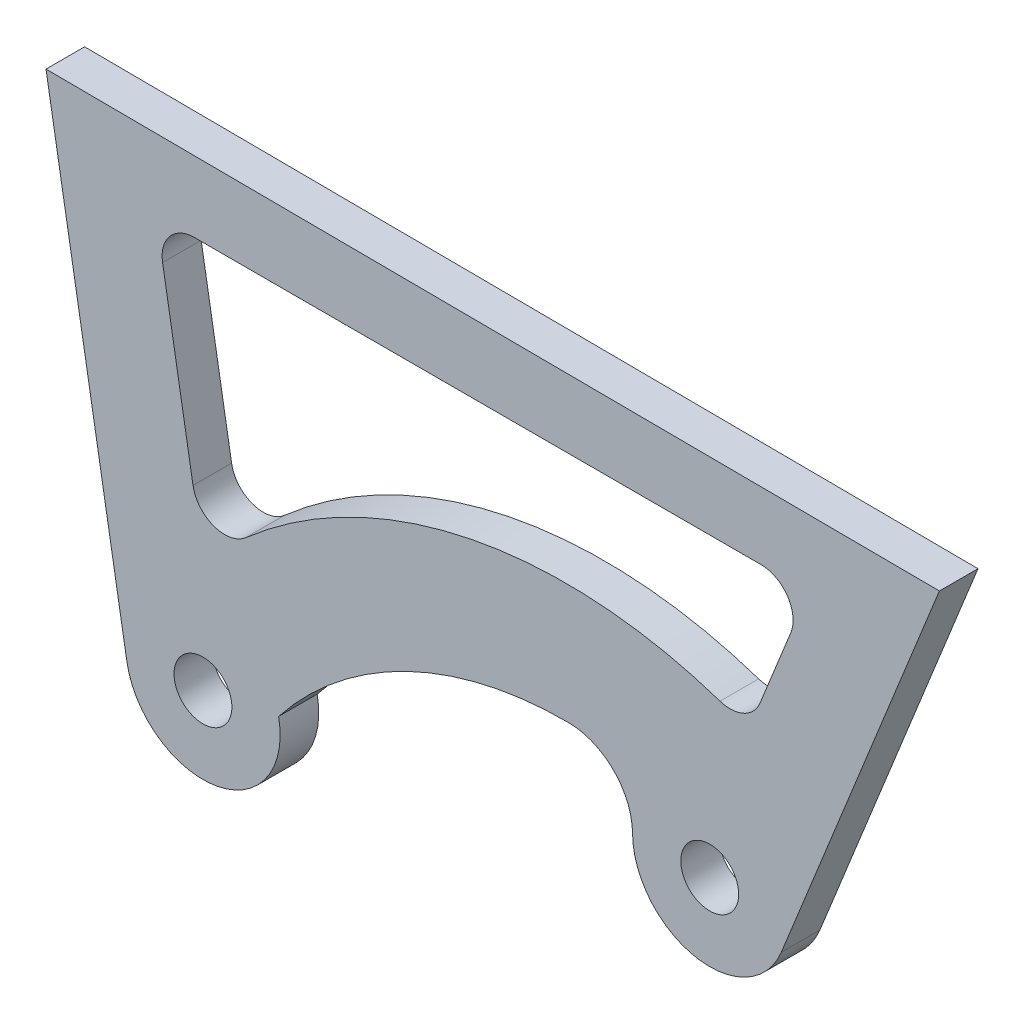
ISO-10303-21;
HEADER;
FILE_DESCRIPTION(('STEP AP214'),'2;1');
FILE_NAME('part.step','',(''),(''),'','','');
FILE_SCHEMA(('AUTOMOTIVE_DESIGN { 1 0 10303 214 1 1 1 1 }'));
ENDSEC;
DATA;
#1=APPLICATION_CONTEXT('core data for automotive mechanical design processes');
#2=APPLICATION_PROTOCOL_DEFINITION('international standard','automotive_design',2000,#1);
#3=PRODUCT_CONTEXT('',#1,'mechanical');
#4=PRODUCT('Part','Part','',(#3));
#5=PRODUCT_RELATED_PRODUCT_CATEGORY('part','',(#4));
#6=PRODUCT_DEFINITION_FORMATION('','',#4);
#7=PRODUCT_DEFINITION_CONTEXT('part definition',#1,'design');
#8=PRODUCT_DEFINITION('design','',#6,#7);
#9=PRODUCT_DEFINITION_SHAPE('','',#8);
#10=(LENGTH_UNIT() NAMED_UNIT(*) SI_UNIT(.MILLI.,.METRE.));
#11=(NAMED_UNIT(*) PLANE_ANGLE_UNIT() SI_UNIT($,.RADIAN.));
#12=(NAMED_UNIT(*) SI_UNIT($,.STERADIAN.) SOLID_ANGLE_UNIT());
#13=UNCERTAINTY_MEASURE_WITH_UNIT(LENGTH_MEASURE(1.E-05),#10,'distance_accuracy_value','');
#14=(GEOMETRIC_REPRESENTATION_CONTEXT(3) GLOBAL_UNCERTAINTY_ASSIGNED_CONTEXT((#13)) GLOBAL_UNIT_ASSIGNED_CONTEXT((#10,
#11,#12)) REPRESENTATION_CONTEXT('',''));
#15=CARTESIAN_POINT('',(0.,0.,0.));
#16=DIRECTION('',(0.,0.,1.));
#17=DIRECTION('',(1.,0.,0.));
#18=AXIS2_PLACEMENT_3D('',#15,#16,#17);
#19=CARTESIAN_POINT('',(4.70013636969245E-13,-372.949836208111,-6.));
#20=DIRECTION('',(0.,1.,0.));
#21=DIRECTION('',(-1.,0.,0.));
#22=AXIS2_PLACEMENT_3D('',#19,#20,#21);
#23=PLANE('',#22);
#24=DIRECTION('',(-1.,0.,0.));
#25=VECTOR('',#24,1.);
#26=CARTESIAN_POINT('',(4.70013636969245E-13,-372.949836208111,0.));
#27=LINE('',#26,#25);
#28=CARTESIAN_POINT('',(510.342575031471,-372.94983620811,0.));
#29=VERTEX_POINT('',#28);
#30=CARTESIAN_POINT('',(422.247791684681,-372.94983620811,0.));
#31=VERTEX_POINT('',#30);
#32=EDGE_CURVE('E207',#29,#31,#27,.T.);
#33=ORIENTED_EDGE('',*,*,#32,.T.);
#34=DIRECTION('',(0.,0.,1.));
#35=VECTOR('',#34,1.);
#36=CARTESIAN_POINT('',(422.247791684681,-372.94983620811,-6.));
#37=LINE('',#36,#35);
#38=CARTESIAN_POINT('',(422.247791684681,-372.94983620811,-6.));
#39=VERTEX_POINT('',#38);
#40=EDGE_CURVE('E11',#39,#31,#37,.T.);
#41=ORIENTED_EDGE('',*,*,#40,.F.);
#42=DIRECTION('',(-1.,0.,0.));
#43=VECTOR('',#42,1.);
#44=CARTESIAN_POINT('',(4.70013636969245E-13,-372.949836208111,-6.));
#45=LINE('',#44,#43);
#46=CARTESIAN_POINT('',(510.342575031471,-372.94983620811,-6.));
#47=VERTEX_POINT('',#46);
#48=EDGE_CURVE('E324',#47,#39,#45,.T.);
#49=ORIENTED_EDGE('',*,*,#48,.F.);
#50=DIRECTION('',(0.,0.,1.));
#51=VECTOR('',#50,1.);
#52=CARTESIAN_POINT('',(510.342575031471,-372.94983620811,-6.));
#53=LINE('',#52,#51);
#54=EDGE_CURVE('E235',#47,#29,#53,.T.);
#55=ORIENTED_EDGE('',*,*,#54,.T.);
#56=EDGE_LOOP('',(#33,#41,#49,#55));
#57=FACE_BOUND('',#56,.T.);
#58=ADVANCED_FACE('F41',(#57),#23,.F.);
#59=CARTESIAN_POINT('',(422.247791684681,-377.94983620811,-6.));
#60=DIRECTION('',(0.,0.,1.));
#61=DIRECTION('',(1.,0.,0.));
#62=AXIS2_PLACEMENT_3D('',#59,#60,#61);
#63=CYLINDRICAL_SURFACE('',#62,5.00000000000012);
#64=CARTESIAN_POINT('',(422.247791684681,-377.94983620811,0.));
#65=DIRECTION('',(0.,0.,1.));
#66=DIRECTION('',(1.,0.,0.));
#67=AXIS2_PLACEMENT_3D('',#64,#65,#66);
#68=CIRCLE('',#67,5.00000000000012);
#69=CARTESIAN_POINT('',(417.319428606997,-378.793185112492,0.));
#70=VERTEX_POINT('',#69);
#71=EDGE_CURVE('E106',#31,#70,#68,.T.);
#72=ORIENTED_EDGE('',*,*,#71,.T.);
#73=DIRECTION('',(0.,0.,1.));
#74=VECTOR('',#73,1.);
#75=CARTESIAN_POINT('',(417.319428606997,-378.793185112492,-6.));
#76=LINE('',#75,#74);
#77=CARTESIAN_POINT('',(417.319428606997,-378.793185112492,-6.));
#78=VERTEX_POINT('',#77);
#79=EDGE_CURVE('E51',#78,#70,#76,.T.);
#80=ORIENTED_EDGE('',*,*,#79,.F.);
#81=CARTESIAN_POINT('',(422.247791684681,-377.94983620811,-6.));
#82=DIRECTION('',(0.,0.,1.));
#83=DIRECTION('',(1.,0.,0.));
#84=AXIS2_PLACEMENT_3D('',#81,#82,#83);
#85=CIRCLE('',#84,5.00000000000012);
#86=EDGE_CURVE('E59',#39,#78,#85,.T.);
#87=ORIENTED_EDGE('',*,*,#86,.F.);
#88=ORIENTED_EDGE('',*,*,#40,.T.);
#89=EDGE_LOOP('',(#72,#80,#87,#88));
#90=FACE_BOUND('',#89,.T.);
#91=ADVANCED_FACE('F273',(#90),#63,.F.);
#92=CARTESIAN_POINT('',(342.471328485273,58.6042089650436,-6.));
#93=DIRECTION('',(-0.985672615536786,-0.168669780876337,0.));
#94=DIRECTION('',(0.168669780876337,-0.985672615536786,0.));
#95=AXIS2_PLACEMENT_3D('',#92,#93,#94);
#96=PLANE('',#95);
#97=DIRECTION('',(0.168669780876337,-0.985672615536786,0.));
#98=VECTOR('',#97,1.);
#99=CARTESIAN_POINT('',(342.471328485273,58.6042089650436,0.));
#100=LINE('',#99,#98);
#101=CARTESIAN_POINT('',(422.050350523312,-406.43975081577,0.));
#102=VERTEX_POINT('',#101);
#103=EDGE_CURVE('E166',#70,#102,#100,.T.);
#104=ORIENTED_EDGE('',*,*,#103,.T.);
#105=DIRECTION('',(0.,0.,1.));
#106=VECTOR('',#105,1.);
#107=CARTESIAN_POINT('',(422.050350523312,-406.43975081577,-6.));
#108=LINE('',#107,#106);
#109=CARTESIAN_POINT('',(422.050350523312,-406.43975081577,-6.));
#110=VERTEX_POINT('',#109);
#111=EDGE_CURVE('E164',#110,#102,#108,.T.);
#112=ORIENTED_EDGE('',*,*,#111,.F.);
#113=DIRECTION('',(0.168669780876337,-0.985672615536786,0.));
#114=VECTOR('',#113,1.);
#115=CARTESIAN_POINT('',(342.471328485273,58.6042089650436,-6.));
#116=LINE('',#115,#114);
#117=EDGE_CURVE('E154',#78,#110,#116,.T.);
#118=ORIENTED_EDGE('',*,*,#117,.F.);
#119=ORIENTED_EDGE('',*,*,#79,.T.);
#120=EDGE_LOOP('',(#104,#112,#118,#119));
#121=FACE_BOUND('',#120,.T.);
#122=ADVANCED_FACE('F165',(#121),#96,.F.);
#123=CARTESIAN_POINT('',(426.978713600997,-405.596401911388,-6.));
#124=DIRECTION('',(0.,0.,1.));
#125=DIRECTION('',(1.,0.,0.));
#126=AXIS2_PLACEMENT_3D('',#123,#124,#125);
#127=CYLINDRICAL_SURFACE('',#126,5.00000000000004);
#128=CARTESIAN_POINT('',(426.978713600997,-405.596401911388,0.));
#129=DIRECTION('',(0.,0.,1.));
#130=DIRECTION('',(1.,0.,0.));
#131=AXIS2_PLACEMENT_3D('',#128,#129,#130);
#132=CIRCLE('',#131,5.00000000000004);
#133=CARTESIAN_POINT('',(430.277606865992,-409.353701902894,0.));
#134=VERTEX_POINT('',#133);
#135=EDGE_CURVE('E222',#102,#134,#132,.T.);
#136=ORIENTED_EDGE('',*,*,#135,.T.);
#137=DIRECTION('',(0.,0.,1.));
#138=VECTOR('',#137,1.);
#139=CARTESIAN_POINT('',(430.277606865992,-409.353701902894,-6.));
#140=LINE('',#139,#138);
#141=CARTESIAN_POINT('',(430.277606865992,-409.353701902894,-6.));
#142=VERTEX_POINT('',#141);
#143=EDGE_CURVE('E170',#142,#134,#140,.T.);
#144=ORIENTED_EDGE('',*,*,#143,.F.);
#145=CARTESIAN_POINT('',(426.978713600997,-405.596401911388,-6.));
#146=DIRECTION('',(0.,0.,1.));
#147=DIRECTION('',(1.,0.,0.));
#148=AXIS2_PLACEMENT_3D('',#145,#146,#147);
#149=CIRCLE('',#148,5.00000000000004);
#150=EDGE_CURVE('E159',#110,#142,#149,.T.);
#151=ORIENTED_EDGE('',*,*,#150,.F.);
#152=ORIENTED_EDGE('',*,*,#111,.T.);
#153=EDGE_LOOP('',(#136,#144,#151,#152));
#154=FACE_BOUND('',#153,.T.);
#155=ADVANCED_FACE('F172',(#154),#127,.F.);
#156=CARTESIAN_POINT('',(480.033722098236,-466.023814065418,-6.));
#157=DIRECTION('',(0.,0.,1.));
#158=DIRECTION('',(1.,0.,0.));
#159=AXIS2_PLACEMENT_3D('',#156,#157,#158);
#160=CYLINDRICAL_SURFACE('',#159,75.4133450757719);
#161=CARTESIAN_POINT('',(480.033722098236,-466.023814065418,0.));
#162=DIRECTION('',(0.,0.,1.));
#163=DIRECTION('',(1.,0.,0.));
#164=AXIS2_PLACEMENT_3D('',#161,#162,#163);
#165=CIRCLE('',#164,75.4133450757719);
#166=CARTESIAN_POINT('',(503.985021193238,-394.515018192608,0.));
#167=VERTEX_POINT('',#166);
#168=EDGE_CURVE('E219',#167,#134,#165,.T.);
#169=ORIENTED_EDGE('',*,*,#168,.F.);
#170=DIRECTION('',(0.,0.,1.));
#171=VECTOR('',#170,1.);
#172=CARTESIAN_POINT('',(503.985021193238,-394.515018192608,-6.));
#173=LINE('',#172,#171);
#174=CARTESIAN_POINT('',(503.985021193238,-394.515018192608,-6.));
#175=VERTEX_POINT('',#174);
#176=EDGE_CURVE('E229',#175,#167,#173,.T.);
#177=ORIENTED_EDGE('',*,*,#176,.F.);
#178=CARTESIAN_POINT('',(480.033722098236,-466.023814065418,-6.));
#179=DIRECTION('',(0.,0.,1.));
#180=DIRECTION('',(1.,0.,0.));
#181=AXIS2_PLACEMENT_3D('',#178,#179,#180);
#182=CIRCLE('',#181,75.4133450757719);
#183=EDGE_CURVE('E174',#175,#142,#182,.T.);
#184=ORIENTED_EDGE('',*,*,#183,.T.);
#185=ORIENTED_EDGE('',*,*,#143,.T.);
#186=EDGE_LOOP('',(#169,#177,#184,#185));
#187=FACE_BOUND('',#186,.T.);
#188=ADVANCED_FACE('F347',(#187),#160,.T.);
#189=CARTESIAN_POINT('',(505.573022565604,-389.773894734886,-6.));
#190=DIRECTION('',(0.,0.,1.));
#191=DIRECTION('',(1.,0.,0.));
#192=AXIS2_PLACEMENT_3D('',#189,#190,#191);
#193=CYLINDRICAL_SURFACE('',#192,4.99999999999996);
#194=CARTESIAN_POINT('',(505.573022565604,-389.773894734886,0.));
#195=DIRECTION('',(0.,0.,1.));
#196=DIRECTION('',(1.,0.,0.));
#197=AXIS2_PLACEMENT_3D('',#194,#195,#196);
#198=CIRCLE('',#197,4.99999999999996);
#199=CARTESIAN_POINT('',(510.209986836227,-391.644339161476,0.));
#200=VERTEX_POINT('',#199);
#201=EDGE_CURVE('E216',#200,#167,#198,.F.);
#202=ORIENTED_EDGE('',*,*,#201,.F.);
#203=DIRECTION('',(0.,0.,1.));
#204=VECTOR('',#203,1.);
#205=CARTESIAN_POINT('',(510.209986836227,-391.644339161476,-6.));
#206=LINE('',#205,#204);
#207=CARTESIAN_POINT('',(510.209986836227,-391.644339161476,-6.));
#208=VERTEX_POINT('',#207);
#209=EDGE_CURVE('E231',#208,#200,#206,.T.);
#210=ORIENTED_EDGE('',*,*,#209,.F.);
#211=CARTESIAN_POINT('',(505.573022565604,-389.773894734886,-6.));
#212=DIRECTION('',(0.,0.,1.));
#213=DIRECTION('',(1.,0.,0.));
#214=AXIS2_PLACEMENT_3D('',#211,#212,#213);
#215=CIRCLE('',#214,4.99999999999996);
#216=EDGE_CURVE('E176',#208,#175,#215,.F.);
#217=ORIENTED_EDGE('',*,*,#216,.T.);
#218=ORIENTED_EDGE('',*,*,#176,.T.);
#219=EDGE_LOOP('',(#202,#210,#217,#218));
#220=FACE_BOUND('',#219,.T.);
#221=ADVANCED_FACE('F335',(#220),#193,.F.);
#222=CARTESIAN_POINT('',(574.682065026918,-231.813488924491,-6.));
#223=DIRECTION('',(-0.927392854124616,0.374088885318179,0.));
#224=DIRECTION('',(-0.374088885318179,-0.927392854124616,0.));
#225=AXIS2_PLACEMENT_3D('',#222,#223,#224);
#226=PLANE('',#225);
#227=DIRECTION('',(-0.374088885318179,-0.927392854124616,0.));
#228=VECTOR('',#227,1.);
#229=CARTESIAN_POINT('',(574.682065026918,-231.813488924491,0.));
#230=LINE('',#229,#228);
#231=CARTESIAN_POINT('',(514.979539302094,-379.820280634701,0.));
#232=VERTEX_POINT('',#231);
#233=EDGE_CURVE('E213',#232,#200,#230,.T.);
#234=ORIENTED_EDGE('',*,*,#233,.F.);
#235=DIRECTION('',(0.,0.,1.));
#236=VECTOR('',#235,1.);
#237=CARTESIAN_POINT('',(514.979539302094,-379.820280634701,-6.));
#238=LINE('',#237,#236);
#239=CARTESIAN_POINT('',(514.979539302094,-379.820280634701,-6.));
#240=VERTEX_POINT('',#239);
#241=EDGE_CURVE('E233',#240,#232,#238,.T.);
#242=ORIENTED_EDGE('',*,*,#241,.F.);
#243=DIRECTION('',(-0.374088885318179,-0.927392854124616,0.));
#244=VECTOR('',#243,1.);
#245=CARTESIAN_POINT('',(574.682065026918,-231.813488924491,-6.));
#246=LINE('',#245,#244);
#247=EDGE_CURVE('E329',#240,#208,#246,.T.);
#248=ORIENTED_EDGE('',*,*,#247,.T.);
#249=ORIENTED_EDGE('',*,*,#209,.T.);
#250=EDGE_LOOP('',(#234,#242,#248,#249));
#251=FACE_BOUND('',#250,.T.);
#252=ADVANCED_FACE('F341',(#251),#226,.T.);
#253=CARTESIAN_POINT('',(480.033722098236,-466.023814065418,-6.));
#254=DIRECTION('',(0.,0.,1.));
#255=DIRECTION('',(1.,0.,0.));
#256=AXIS2_PLACEMENT_3D('',#253,#254,#255);
#257=CYLINDRICAL_SURFACE('',#256,56.8388580028496);
#258=CARTESIAN_POINT('',(480.033722098236,-466.023814065418,0.));
#259=DIRECTION('',(0.,0.,1.));
#260=DIRECTION('',(1.,0.,0.));
#261=AXIS2_PLACEMENT_3D('',#258,#259,#260);
#262=CIRCLE('',#261,56.8388580028496);
#263=CARTESIAN_POINT('',(480.456241603531,-409.186526512828,0.));
#264=VERTEX_POINT('',#263);
#265=CARTESIAN_POINT('',(435.358389017244,-430.884514226485,0.));
#266=VERTEX_POINT('',#265);
#267=EDGE_CURVE('E187',#264,#266,#262,.T.);
#268=ORIENTED_EDGE('',*,*,#267,.T.);
#269=DIRECTION('',(0.,0.,1.));
#270=VECTOR('',#269,1.);
#271=CARTESIAN_POINT('',(435.358389017244,-430.884514226485,-6.));
#272=LINE('',#271,#270);
#273=CARTESIAN_POINT('',(435.358389017244,-430.884514226485,-6.));
#274=VERTEX_POINT('',#273);
#275=EDGE_CURVE('E237',#274,#266,#272,.T.);
#276=ORIENTED_EDGE('',*,*,#275,.F.);
#277=CARTESIAN_POINT('',(480.033722098236,-466.023814065418,-6.));
#278=DIRECTION('',(0.,0.,1.));
#279=DIRECTION('',(1.,0.,0.));
#280=AXIS2_PLACEMENT_3D('',#277,#278,#279);
#281=CIRCLE('',#280,56.8388580028496);
#282=CARTESIAN_POINT('',(480.456241603531,-409.186526512828,-6.));
#283=VERTEX_POINT('',#282);
#284=EDGE_CURVE('E253',#283,#274,#281,.T.);
#285=ORIENTED_EDGE('',*,*,#284,.F.);
#286=DIRECTION('',(0.,0.,1.));
#287=VECTOR('',#286,1.);
#288=CARTESIAN_POINT('',(480.456241603531,-409.186526512828,-6.));
#289=LINE('',#288,#287);
#290=EDGE_CURVE('E45',#283,#264,#289,.T.);
#291=ORIENTED_EDGE('',*,*,#290,.T.);
#292=EDGE_LOOP('',(#268,#276,#285,#291));
#293=FACE_BOUND('',#292,.T.);
#294=ADVANCED_FACE('F251',(#293),#257,.F.);
#295=CARTESIAN_POINT('',(423.598466955639,-433.272867865499,-6.));
#296=DIRECTION('',(0.,0.,1.));
#297=DIRECTION('',(1.,0.,0.));
#298=AXIS2_PLACEMENT_3D('',#295,#296,#297);
#299=CYLINDRICAL_SURFACE('',#298,12.);
#300=CARTESIAN_POINT('',(423.598466955639,-433.272867865499,0.));
#301=DIRECTION('',(0.,0.,1.));
#302=DIRECTION('',(1.,0.,0.));
#303=AXIS2_PLACEMENT_3D('',#300,#301,#302);
#304=CIRCLE('',#303,12.);
#305=CARTESIAN_POINT('',(411.770395569198,-435.296905236015,0.));
#306=VERTEX_POINT('',#305);
#307=EDGE_CURVE('E204',#306,#266,#304,.T.);
#308=ORIENTED_EDGE('',*,*,#307,.F.);
#309=DIRECTION('',(0.,0.,1.));
#310=VECTOR('',#309,1.);
#311=CARTESIAN_POINT('',(411.770395569198,-435.296905236015,-6.));
#312=LINE('',#311,#310);
#313=CARTESIAN_POINT('',(411.770395569198,-435.296905236015,-6.));
#314=VERTEX_POINT('',#313);
#315=EDGE_CURVE('E239',#314,#306,#312,.T.);
#316=ORIENTED_EDGE('',*,*,#315,.F.);
#317=CARTESIAN_POINT('',(423.598466955639,-433.272867865499,-6.));
#318=DIRECTION('',(0.,0.,1.));
#319=DIRECTION('',(1.,0.,0.));
#320=AXIS2_PLACEMENT_3D('',#317,#318,#319);
#321=CIRCLE('',#320,12.);
#322=EDGE_CURVE('E321',#314,#274,#321,.T.);
#323=ORIENTED_EDGE('',*,*,#322,.T.);
#324=ORIENTED_EDGE('',*,*,#275,.T.);
#325=EDGE_LOOP('',(#308,#316,#323,#324));
#326=FACE_BOUND('',#325,.T.);
#327=ADVANCED_FACE('F284',(#326),#299,.T.);
#328=CARTESIAN_POINT('',(327.686239252221,56.074162251899,-6.));
#329=DIRECTION('',(-0.985672615536785,-0.168669780876338,0.));
#330=DIRECTION('',(0.168669780876338,-0.985672615536786,0.));
#331=AXIS2_PLACEMENT_3D('',#328,#329,#330);
#332=PLANE('',#331);
#333=DIRECTION('',(0.168669780876338,-0.985672615536786,0.));
#334=VECTOR('',#333,1.);
#335=CARTESIAN_POINT('',(327.686239252221,56.074162251899,0.));
#336=LINE('',#335,#334);
#337=CARTESIAN_POINT('',(399.195756936077,-361.813220805164,0.));
#338=VERTEX_POINT('',#337);
#339=EDGE_CURVE('E201',#338,#306,#336,.T.);
#340=ORIENTED_EDGE('',*,*,#339,.F.);
#341=DIRECTION('',(0.,0.,1.));
#342=VECTOR('',#341,1.);
#343=CARTESIAN_POINT('',(399.195756936077,-361.813220805164,-6.));
#344=LINE('',#343,#342);
#345=CARTESIAN_POINT('',(399.195756936077,-361.813220805164,-6.));
#346=VERTEX_POINT('',#345);
#347=EDGE_CURVE('E241',#346,#338,#344,.T.);
#348=ORIENTED_EDGE('',*,*,#347,.F.);
#349=DIRECTION('',(0.168669780876338,-0.985672615536786,0.));
#350=VECTOR('',#349,1.);
#351=CARTESIAN_POINT('',(327.686239252221,56.074162251899,-6.));
#352=LINE('',#351,#350);
#353=EDGE_CURVE('E318',#346,#314,#352,.T.);
#354=ORIENTED_EDGE('',*,*,#353,.T.);
#355=ORIENTED_EDGE('',*,*,#315,.T.);
#356=EDGE_LOOP('',(#340,#348,#354,#355));
#357=FACE_BOUND('',#356,.T.);
#358=ADVANCED_FACE('F287',(#357),#332,.T.);
#359=CARTESIAN_POINT('',(-2.12031406122108,-359.445921421253,-6.));
#360=DIRECTION('',(-0.00589873760214353,-0.99998260229601,0.));
#361=DIRECTION('',(0.999982602296011,-0.00589873760214353,0.));
#362=AXIS2_PLACEMENT_3D('',#359,#360,#361);
#363=PLANE('',#362);
#364=DIRECTION('',(0.999982602296011,-0.00589873760214353,0.));
#365=VECTOR('',#364,1.);
#366=CARTESIAN_POINT('',(-2.12031406122108,-359.445921421253,0.));
#367=LINE('',#366,#365);
#368=CARTESIAN_POINT('',(538.087061333459,-362.632518418921,0.));
#369=VERTEX_POINT('',#368);
#370=EDGE_CURVE('E199',#338,#369,#367,.T.);
#371=ORIENTED_EDGE('',*,*,#370,.T.);
#372=DIRECTION('',(0.,0.,1.));
#373=VECTOR('',#372,1.);
#374=CARTESIAN_POINT('',(538.087061333459,-362.632518418921,-6.));
#375=LINE('',#374,#373);
#376=CARTESIAN_POINT('',(538.087061333459,-362.632518418921,-6.));
#377=VERTEX_POINT('',#376);
#378=EDGE_CURVE('E243',#377,#369,#375,.T.);
#379=ORIENTED_EDGE('',*,*,#378,.F.);
#380=DIRECTION('',(0.999982602296011,-0.00589873760214353,0.));
#381=VECTOR('',#380,1.);
#382=CARTESIAN_POINT('',(-2.12031406122108,-359.445921421253,-6.));
#383=LINE('',#382,#381);
#384=EDGE_CURVE('E312',#346,#377,#383,.T.);
#385=ORIENTED_EDGE('',*,*,#384,.F.);
#386=ORIENTED_EDGE('',*,*,#347,.T.);
#387=EDGE_LOOP('',(#371,#379,#385,#386));
#388=FACE_BOUND('',#387,.T.);
#389=ADVANCED_FACE('F291',(#388),#363,.F.);
#390=CARTESIAN_POINT('',(588.592957838787,-237.424822204263,-6.));
#391=DIRECTION('',(-0.927392854124617,0.374088885318178,0.));
#392=DIRECTION('',(-0.374088885318178,-0.927392854124617,0.));
#393=AXIS2_PLACEMENT_3D('',#390,#391,#392);
#394=PLANE('',#393);
#395=DIRECTION('',(-0.374088885318178,-0.927392854124617,0.));
#396=VECTOR('',#395,1.);
#397=CARTESIAN_POINT('',(588.592957838787,-237.424822204263,0.));
#398=LINE('',#397,#396);
#399=CARTESIAN_POINT('',(513.510317286383,-423.560008385703,0.));
#400=VERTEX_POINT('',#399);
#401=EDGE_CURVE('E196',#369,#400,#398,.T.);
#402=ORIENTED_EDGE('',*,*,#401,.T.);
#403=DIRECTION('',(0.,0.,1.));
#404=VECTOR('',#403,1.);
#405=CARTESIAN_POINT('',(513.510317286383,-423.560008385703,-6.));
#406=LINE('',#405,#404);
#407=CARTESIAN_POINT('',(513.510317286383,-423.560008385703,-6.));
#408=VERTEX_POINT('',#407);
#409=EDGE_CURVE('E246',#408,#400,#406,.T.);
#410=ORIENTED_EDGE('',*,*,#409,.F.);
#411=DIRECTION('',(-0.374088885318178,-0.927392854124617,0.));
#412=VECTOR('',#411,1.);
#413=CARTESIAN_POINT('',(588.592957838787,-237.424822204263,-6.));
#414=LINE('',#413,#412);
#415=EDGE_CURVE('E309',#377,#408,#414,.T.);
#416=ORIENTED_EDGE('',*,*,#415,.F.);
#417=ORIENTED_EDGE('',*,*,#378,.T.);
#418=EDGE_LOOP('',(#402,#410,#416,#417));
#419=FACE_BOUND('',#418,.T.);
#420=ADVANCED_FACE('F268',(#419),#394,.F.);
#421=CARTESIAN_POINT('',(502.381603036888,-419.070941761885,-6.));
#422=DIRECTION('',(0.,0.,1.));
#423=DIRECTION('',(1.,0.,0.));
#424=AXIS2_PLACEMENT_3D('',#421,#422,#423);
#425=CYLINDRICAL_SURFACE('',#424,12.);
#426=CARTESIAN_POINT('',(502.381603036888,-419.070941761885,0.));
#427=DIRECTION('',(0.,0.,1.));
#428=DIRECTION('',(1.,0.,0.));
#429=AXIS2_PLACEMENT_3D('',#426,#427,#428);
#430=CIRCLE('',#429,12.);
#431=CARTESIAN_POINT('',(490.381767864952,-419.13383728129,0.));
#432=VERTEX_POINT('',#431);
#433=EDGE_CURVE('E193',#432,#400,#430,.T.);
#434=ORIENTED_EDGE('',*,*,#433,.F.);
#435=DIRECTION('',(0.,0.,1.));
#436=VECTOR('',#435,1.);
#437=CARTESIAN_POINT('',(490.381767864952,-419.13383728129,-6.));
#438=LINE('',#437,#436);
#439=CARTESIAN_POINT('',(490.381767864952,-419.13383728129,-6.));
#440=VERTEX_POINT('',#439);
#441=EDGE_CURVE('E247',#440,#432,#438,.T.);
#442=ORIENTED_EDGE('',*,*,#441,.F.);
#443=CARTESIAN_POINT('',(502.381603036888,-419.070941761885,-6.));
#444=DIRECTION('',(0.,0.,1.));
#445=DIRECTION('',(1.,0.,0.));
#446=AXIS2_PLACEMENT_3D('',#443,#444,#445);
#447=CIRCLE('',#446,12.);
#448=EDGE_CURVE('E307',#440,#408,#447,.T.);
#449=ORIENTED_EDGE('',*,*,#448,.T.);
#450=ORIENTED_EDGE('',*,*,#409,.T.);
#451=EDGE_LOOP('',(#434,#442,#449,#450));
#452=FACE_BOUND('',#451,.T.);
#453=ADVANCED_FACE('F261',(#452),#425,.T.);
#454=CARTESIAN_POINT('',(480.381905221671,-419.186250214128,-6.));
#455=DIRECTION('',(0.,0.,1.));
#456=DIRECTION('',(1.,0.,0.));
#457=AXIS2_PLACEMENT_3D('',#454,#455,#456);
#458=CYLINDRICAL_SURFACE('',#457,9.99999999999999);
#459=CARTESIAN_POINT('',(480.381905221671,-419.186250214128,0.));
#460=DIRECTION('',(0.,0.,1.));
#461=DIRECTION('',(1.,0.,0.));
#462=AXIS2_PLACEMENT_3D('',#459,#460,#461);
#463=CIRCLE('',#462,9.99999999999999);
#464=EDGE_CURVE('E190',#264,#432,#463,.F.);
#465=ORIENTED_EDGE('',*,*,#464,.F.);
#466=ORIENTED_EDGE('',*,*,#290,.F.);
#467=CARTESIAN_POINT('',(480.381905221671,-419.186250214128,-6.));
#468=DIRECTION('',(0.,0.,1.));
#469=DIRECTION('',(1.,0.,0.));
#470=AXIS2_PLACEMENT_3D('',#467,#468,#469);
#471=CIRCLE('',#470,9.99999999999999);
#472=EDGE_CURVE('E310',#283,#440,#471,.F.);
#473=ORIENTED_EDGE('',*,*,#472,.T.);
#474=ORIENTED_EDGE('',*,*,#441,.T.);
#475=EDGE_LOOP('',(#465,#466,#473,#474));
#476=FACE_BOUND('',#475,.T.);
#477=ADVANCED_FACE('F258',(#476),#458,.F.);
#478=CARTESIAN_POINT('',(502.381603036888,-419.070941761885,-6.));
#479=DIRECTION('',(0.,0.,1.));
#480=DIRECTION('',(1.,0.,0.));
#481=AXIS2_PLACEMENT_3D('',#478,#479,#480);
#482=CYLINDRICAL_SURFACE('',#481,4.50000000000013);
#483=CARTESIAN_POINT('',(502.381603036888,-419.070941761885,-6.));
#484=DIRECTION('',(0.,0.,1.));
#485=DIRECTION('',(1.,0.,0.));
#486=AXIS2_PLACEMENT_3D('',#483,#484,#485);
#487=CIRCLE('',#486,4.50000000000013);
#488=CARTESIAN_POINT('',(506.881603036888,-419.070941761885,-6.));
#489=VERTEX_POINT('',#488);
#490=EDGE_CURVE('E561',#489,#489,#487,.T.);
#491=ORIENTED_EDGE('',*,*,#490,.F.);
#492=EDGE_LOOP('',(#491));
#493=FACE_BOUND('',#492,.T.);
#494=CARTESIAN_POINT('',(502.381603036888,-419.070941761885,0.));
#495=DIRECTION('',(0.,0.,1.));
#496=DIRECTION('',(1.,0.,0.));
#497=AXIS2_PLACEMENT_3D('',#494,#495,#496);
#498=CIRCLE('',#497,4.50000000000013);
#499=CARTESIAN_POINT('',(506.881603036888,-419.070941761885,0.));
#500=VERTEX_POINT('',#499);
#501=EDGE_CURVE('E184',#500,#500,#498,.T.);
#502=ORIENTED_EDGE('',*,*,#501,.T.);
#503=EDGE_LOOP('',(#502));
#504=FACE_BOUND('',#503,.T.);
#505=ADVANCED_FACE('F260',(#493,#504),#482,.F.);
#506=CARTESIAN_POINT('',(423.598466955639,-433.272867865499,-6.));
#507=DIRECTION('',(0.,0.,1.));
#508=DIRECTION('',(1.,0.,0.));
#509=AXIS2_PLACEMENT_3D('',#506,#507,#508);
#510=CYLINDRICAL_SURFACE('',#509,4.49999999999997);
#511=CARTESIAN_POINT('',(423.598466955639,-433.272867865499,-6.));
#512=DIRECTION('',(0.,0.,1.));
#513=DIRECTION('',(1.,0.,0.));
#514=AXIS2_PLACEMENT_3D('',#511,#512,#513);
#515=CIRCLE('',#514,4.49999999999997);
#516=CARTESIAN_POINT('',(428.098466955639,-433.272867865499,-6.));
#517=VERTEX_POINT('',#516);
#518=EDGE_CURVE('E225',#517,#517,#515,.T.);
#519=ORIENTED_EDGE('',*,*,#518,.F.);
#520=EDGE_LOOP('',(#519));
#521=FACE_BOUND('',#520,.T.);
#522=CARTESIAN_POINT('',(423.598466955639,-433.272867865499,0.));
#523=DIRECTION('',(0.,0.,1.));
#524=DIRECTION('',(1.,0.,0.));
#525=AXIS2_PLACEMENT_3D('',#522,#523,#524);
#526=CIRCLE('',#525,4.49999999999997);
#527=CARTESIAN_POINT('',(428.098466955639,-433.272867865499,0.));
#528=VERTEX_POINT('',#527);
#529=EDGE_CURVE('E181',#528,#528,#526,.T.);
#530=ORIENTED_EDGE('',*,*,#529,.T.);
#531=EDGE_LOOP('',(#530));
#532=FACE_BOUND('',#531,.T.);
#533=ADVANCED_FACE('F43',(#521,#532),#510,.F.);
#534=CARTESIAN_POINT('',(510.342575031471,-377.94983620811,-6.));
#535=DIRECTION('',(0.,0.,1.));
#536=DIRECTION('',(1.,0.,0.));
#537=AXIS2_PLACEMENT_3D('',#534,#535,#536);
#538=CYLINDRICAL_SURFACE('',#537,4.99999999999997);
#539=CARTESIAN_POINT('',(510.342575031471,-377.94983620811,0.));
#540=DIRECTION('',(0.,0.,1.));
#541=DIRECTION('',(1.,0.,0.));
#542=AXIS2_PLACEMENT_3D('',#539,#540,#541);
#543=CIRCLE('',#542,4.99999999999997);
#544=EDGE_CURVE('E210',#29,#232,#543,.F.);
#545=ORIENTED_EDGE('',*,*,#544,.F.);
#546=ORIENTED_EDGE('',*,*,#54,.F.);
#547=CARTESIAN_POINT('',(510.342575031471,-377.94983620811,-6.));
#548=DIRECTION('',(0.,0.,1.));
#549=DIRECTION('',(1.,0.,0.));
#550=AXIS2_PLACEMENT_3D('',#547,#548,#549);
#551=CIRCLE('',#550,4.99999999999997);
#552=EDGE_CURVE('E326',#47,#240,#551,.F.);
#553=ORIENTED_EDGE('',*,*,#552,.T.);
#554=ORIENTED_EDGE('',*,*,#241,.T.);
#555=EDGE_LOOP('',(#545,#546,#553,#554));
#556=FACE_BOUND('',#555,.T.);
#557=ADVANCED_FACE('F282',(#556),#538,.F.);
#558=CARTESIAN_POINT('',(0.,0.,-6.));
#559=DIRECTION('',(0.,0.,1.));
#560=DIRECTION('',(1.,0.,0.));
#561=AXIS2_PLACEMENT_3D('',#558,#559,#560);
#562=PLANE('',#561);
#563=ORIENTED_EDGE('',*,*,#518,.T.);
#564=EDGE_LOOP('',(#563));
#565=FACE_BOUND('',#564,.T.);
#566=ORIENTED_EDGE('',*,*,#490,.T.);
#567=EDGE_LOOP('',(#566));
#568=FACE_BOUND('',#567,.T.);
#569=ORIENTED_EDGE('',*,*,#284,.T.);
#570=ORIENTED_EDGE('',*,*,#322,.F.);
#571=ORIENTED_EDGE('',*,*,#353,.F.);
#572=ORIENTED_EDGE('',*,*,#384,.T.);
#573=ORIENTED_EDGE('',*,*,#415,.T.);
#574=ORIENTED_EDGE('',*,*,#448,.F.);
#575=ORIENTED_EDGE('',*,*,#472,.F.);
#576=EDGE_LOOP('',(#569,#570,#571,#572,#573,#574,#575));
#577=FACE_BOUND('',#576,.T.);
#578=ORIENTED_EDGE('',*,*,#48,.T.);
#579=ORIENTED_EDGE('',*,*,#86,.T.);
#580=ORIENTED_EDGE('',*,*,#117,.T.);
#581=ORIENTED_EDGE('',*,*,#150,.T.);
#582=ORIENTED_EDGE('',*,*,#183,.F.);
#583=ORIENTED_EDGE('',*,*,#216,.F.);
#584=ORIENTED_EDGE('',*,*,#247,.F.);
#585=ORIENTED_EDGE('',*,*,#552,.F.);
#586=EDGE_LOOP('',(#578,#579,#580,#581,#582,#583,#584,#585));
#587=FACE_BOUND('',#586,.T.);
#588=ADVANCED_FACE('F156',(#565,#568,#577,#587),#562,.F.);
#589=CARTESIAN_POINT('',(0.,0.,0.));
#590=DIRECTION('',(0.,0.,1.));
#591=DIRECTION('',(1.,0.,0.));
#592=AXIS2_PLACEMENT_3D('',#589,#590,#591);
#593=PLANE('',#592);
#594=ORIENTED_EDGE('',*,*,#529,.F.);
#595=EDGE_LOOP('',(#594));
#596=FACE_BOUND('',#595,.T.);
#597=ORIENTED_EDGE('',*,*,#501,.F.);
#598=EDGE_LOOP('',(#597));
#599=FACE_BOUND('',#598,.T.);
#600=ORIENTED_EDGE('',*,*,#267,.F.);
#601=ORIENTED_EDGE('',*,*,#464,.T.);
#602=ORIENTED_EDGE('',*,*,#433,.T.);
#603=ORIENTED_EDGE('',*,*,#401,.F.);
#604=ORIENTED_EDGE('',*,*,#370,.F.);
#605=ORIENTED_EDGE('',*,*,#339,.T.);
#606=ORIENTED_EDGE('',*,*,#307,.T.);
#607=EDGE_LOOP('',(#600,#601,#602,#603,#604,#605,#606));
#608=FACE_BOUND('',#607,.T.);
#609=ORIENTED_EDGE('',*,*,#32,.F.);
#610=ORIENTED_EDGE('',*,*,#544,.T.);
#611=ORIENTED_EDGE('',*,*,#233,.T.);
#612=ORIENTED_EDGE('',*,*,#201,.T.);
#613=ORIENTED_EDGE('',*,*,#168,.T.);
#614=ORIENTED_EDGE('',*,*,#135,.F.);
#615=ORIENTED_EDGE('',*,*,#103,.F.);
#616=ORIENTED_EDGE('',*,*,#71,.F.);
#617=EDGE_LOOP('',(#609,#610,#611,#612,#613,#614,#615,#616));
#618=FACE_BOUND('',#617,.T.);
#619=ADVANCED_FACE('F256',(#596,#599,#608,#618),#593,.T.);
#620=CLOSED_SHELL('',(#58,#91,#122,#155,#188,#221,#252,#294,#327,#358,#389,#420,#453,#477,#505,
#533,#557,#588,#619));
#621=MANIFOLD_SOLID_BREP('B2',#620);
#622=ADVANCED_BREP_SHAPE_REPRESENTATION('',(#18,#621),#14);
#623=SHAPE_DEFINITION_REPRESENTATION(#9,#622);
ENDSEC;
END-ISO-10303-21;
